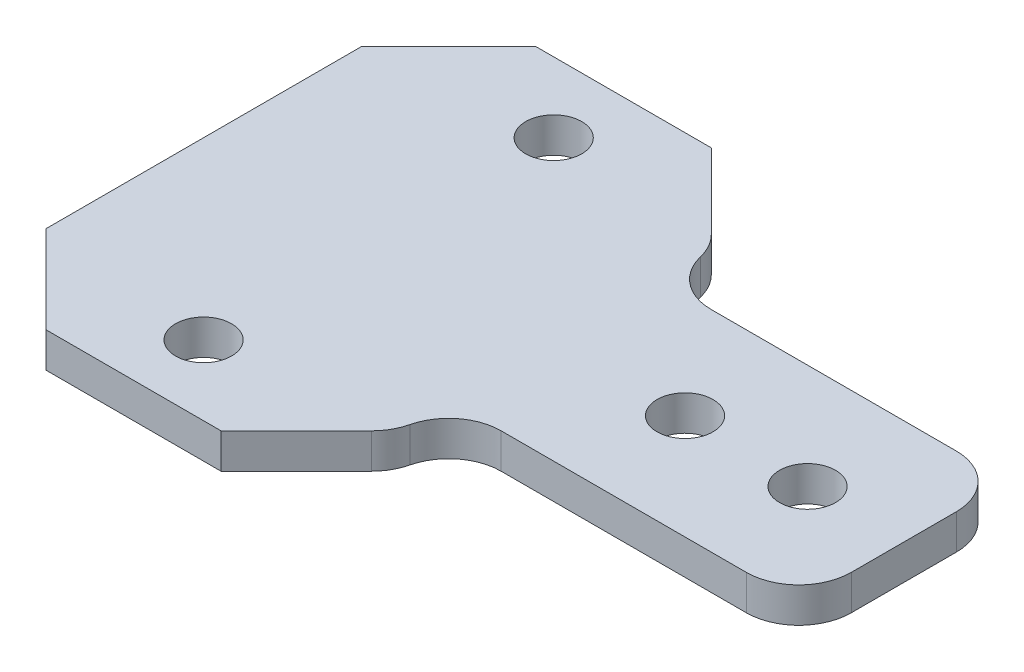
ISO-10303-21;
HEADER;
FILE_DESCRIPTION(('STEP AP214'),'2;1');
FILE_NAME('part.step','',(''),(''),'','','');
FILE_SCHEMA(('AUTOMOTIVE_DESIGN { 1 0 10303 214 1 1 1 1 }'));
ENDSEC;
DATA;
#1=APPLICATION_CONTEXT('core data for automotive mechanical design processes');
#2=APPLICATION_PROTOCOL_DEFINITION('international standard','automotive_design',2000,#1);
#3=PRODUCT_CONTEXT('',#1,'mechanical');
#4=PRODUCT('Part','Part','',(#3));
#5=PRODUCT_RELATED_PRODUCT_CATEGORY('part','',(#4));
#6=PRODUCT_DEFINITION_FORMATION('','',#4);
#7=PRODUCT_DEFINITION_CONTEXT('part definition',#1,'design');
#8=PRODUCT_DEFINITION('design','',#6,#7);
#9=PRODUCT_DEFINITION_SHAPE('','',#8);
#10=(LENGTH_UNIT() NAMED_UNIT(*) SI_UNIT(.MILLI.,.METRE.));
#11=(NAMED_UNIT(*) PLANE_ANGLE_UNIT() SI_UNIT($,.RADIAN.));
#12=(NAMED_UNIT(*) SI_UNIT($,.STERADIAN.) SOLID_ANGLE_UNIT());
#13=UNCERTAINTY_MEASURE_WITH_UNIT(LENGTH_MEASURE(1.E-05),#10,'distance_accuracy_value','');
#14=(GEOMETRIC_REPRESENTATION_CONTEXT(3) GLOBAL_UNCERTAINTY_ASSIGNED_CONTEXT((#13)) GLOBAL_UNIT_ASSIGNED_CONTEXT((#10,
#11,#12)) REPRESENTATION_CONTEXT('',''));
#15=CARTESIAN_POINT('',(0.,0.,0.));
#16=DIRECTION('',(0.,0.,1.));
#17=DIRECTION('',(1.,0.,0.));
#18=AXIS2_PLACEMENT_3D('',#15,#16,#17);
#19=CARTESIAN_POINT('',(0.,2.,0.));
#20=DIRECTION('',(0.,-1.,0.));
#21=DIRECTION('',(0.,0.,-1.));
#22=AXIS2_PLACEMENT_3D('',#19,#20,#21);
#23=PLANE('',#22);
#24=DIRECTION('',(-0.707106781186549,0.,0.707106781186547));
#25=VECTOR('',#24,1.);
#26=CARTESIAN_POINT('',(10.,2.,9.));
#27=LINE('',#26,#25);
#28=CARTESIAN_POINT('',(4.99999999999999,2.,14.));
#29=VERTEX_POINT('',#28);
#30=CARTESIAN_POINT('',(9.28956136268815,2.,9.71043863731185));
#31=VERTEX_POINT('',#30);
#32=EDGE_CURVE('E196',#29,#31,#27,.F.);
#33=ORIENTED_EDGE('',*,*,#32,.T.);
#34=CARTESIAN_POINT('',(7.16824101912851,2.,7.58911829375221));
#35=DIRECTION('',(0.,-1.,0.));
#36=DIRECTION('',(0.,0.,-1.));
#37=AXIS2_PLACEMENT_3D('',#34,#35,#36);
#38=CIRCLE('',#37,3.);
#39=CARTESIAN_POINT('',(10.0841205095643,2.,8.29455914687611));
#40=VERTEX_POINT('',#39);
#41=EDGE_CURVE('E249',#31,#40,#38,.F.);
#42=ORIENTED_EDGE('',*,*,#41,.T.);
#43=CARTESIAN_POINT('',(13.,2.,9.));
#44=DIRECTION('',(0.,-1.,0.));
#45=DIRECTION('',(0.,0.,-1.));
#46=AXIS2_PLACEMENT_3D('',#43,#44,#45);
#47=CIRCLE('',#46,3.);
#48=CARTESIAN_POINT('',(13.,2.,6.));
#49=VERTEX_POINT('',#48);
#50=EDGE_CURVE('E233',#40,#49,#47,.T.);
#51=ORIENTED_EDGE('',*,*,#50,.T.);
#52=DIRECTION('',(1.,0.,0.));
#53=VECTOR('',#52,1.);
#54=CARTESIAN_POINT('',(10.,2.,6.));
#55=LINE('',#54,#53);
#56=CARTESIAN_POINT('',(27.,2.,6.));
#57=VERTEX_POINT('',#56);
#58=EDGE_CURVE('E174',#49,#57,#55,.T.);
#59=ORIENTED_EDGE('',*,*,#58,.T.);
#60=CARTESIAN_POINT('',(27.,2.,3.));
#61=DIRECTION('',(0.,-1.,0.));
#62=DIRECTION('',(0.,0.,-1.));
#63=AXIS2_PLACEMENT_3D('',#60,#61,#62);
#64=CIRCLE('',#63,3.);
#65=CARTESIAN_POINT('',(30.,2.,3.));
#66=VERTEX_POINT('',#65);
#67=EDGE_CURVE('E227',#57,#66,#64,.F.);
#68=ORIENTED_EDGE('',*,*,#67,.T.);
#69=DIRECTION('',(0.,0.,-1.));
#70=VECTOR('',#69,1.);
#71=CARTESIAN_POINT('',(30.,2.,-6.));
#72=LINE('',#71,#70);
#73=CARTESIAN_POINT('',(30.,2.,-3.));
#74=VERTEX_POINT('',#73);
#75=EDGE_CURVE('E178',#66,#74,#72,.T.);
#76=ORIENTED_EDGE('',*,*,#75,.T.);
#77=CARTESIAN_POINT('',(27.,2.,-3.));
#78=DIRECTION('',(0.,-1.,0.));
#79=DIRECTION('',(0.,0.,-1.));
#80=AXIS2_PLACEMENT_3D('',#77,#78,#79);
#81=CIRCLE('',#80,3.);
#82=CARTESIAN_POINT('',(27.,2.,-6.));
#83=VERTEX_POINT('',#82);
#84=EDGE_CURVE('E229',#74,#83,#81,.F.);
#85=ORIENTED_EDGE('',*,*,#84,.T.);
#86=DIRECTION('',(-1.,0.,0.));
#87=VECTOR('',#86,1.);
#88=CARTESIAN_POINT('',(10.,2.,-6.));
#89=LINE('',#88,#87);
#90=CARTESIAN_POINT('',(13.,2.,-6.));
#91=VERTEX_POINT('',#90);
#92=EDGE_CURVE('E259',#83,#91,#89,.T.);
#93=ORIENTED_EDGE('',*,*,#92,.T.);
#94=CARTESIAN_POINT('',(13.,2.,-9.));
#95=DIRECTION('',(0.,-1.,0.));
#96=DIRECTION('',(0.,0.,-1.));
#97=AXIS2_PLACEMENT_3D('',#94,#95,#96);
#98=CIRCLE('',#97,3.);
#99=CARTESIAN_POINT('',(10.0841205095643,2.,-8.29455914687609));
#100=VERTEX_POINT('',#99);
#101=EDGE_CURVE('E237',#91,#100,#98,.T.);
#102=ORIENTED_EDGE('',*,*,#101,.T.);
#103=CARTESIAN_POINT('',(7.16824101912852,2.,-7.58911829375219));
#104=DIRECTION('',(0.,-1.,0.));
#105=DIRECTION('',(0.,0.,-1.));
#106=AXIS2_PLACEMENT_3D('',#103,#104,#105);
#107=CIRCLE('',#106,3.);
#108=CARTESIAN_POINT('',(9.28956136268816,2.,-9.71043863731183));
#109=VERTEX_POINT('',#108);
#110=EDGE_CURVE('E50',#100,#109,#107,.F.);
#111=ORIENTED_EDGE('',*,*,#110,.T.);
#112=DIRECTION('',(0.707106781186547,0.,0.707106781186548));
#113=VECTOR('',#112,1.);
#114=CARTESIAN_POINT('',(4.99999999999999,2.,-14.));
#115=LINE('',#114,#113);
#116=CARTESIAN_POINT('',(4.99999999999999,2.,-14.));
#117=VERTEX_POINT('',#116);
#118=EDGE_CURVE('E194',#109,#117,#115,.F.);
#119=ORIENTED_EDGE('',*,*,#118,.T.);
#120=DIRECTION('',(-1.,0.,0.));
#121=VECTOR('',#120,1.);
#122=CARTESIAN_POINT('',(-10.,2.,-14.));
#123=LINE('',#122,#121);
#124=CARTESIAN_POINT('',(-4.99999999999999,2.,-14.));
#125=VERTEX_POINT('',#124);
#126=EDGE_CURVE('E264',#117,#125,#123,.T.);
#127=ORIENTED_EDGE('',*,*,#126,.T.);
#128=DIRECTION('',(0.707106781186549,0.,-0.707106781186546));
#129=VECTOR('',#128,1.);
#130=CARTESIAN_POINT('',(-10.,2.,-9.00000000000001));
#131=LINE('',#130,#129);
#132=CARTESIAN_POINT('',(-10.,2.,-9.00000000000001));
#133=VERTEX_POINT('',#132);
#134=EDGE_CURVE('E192',#125,#133,#131,.F.);
#135=ORIENTED_EDGE('',*,*,#134,.T.);
#136=DIRECTION('',(0.,0.,1.));
#137=VECTOR('',#136,1.);
#138=CARTESIAN_POINT('',(-9.99999999999999,2.,14.));
#139=LINE('',#138,#137);
#140=CARTESIAN_POINT('',(-9.99999999999999,2.,9.));
#141=VERTEX_POINT('',#140);
#142=EDGE_CURVE('E267',#133,#141,#139,.T.);
#143=ORIENTED_EDGE('',*,*,#142,.T.);
#144=DIRECTION('',(-0.707106781186547,0.,-0.707106781186548));
#145=VECTOR('',#144,1.);
#146=CARTESIAN_POINT('',(-5.,2.,14.));
#147=LINE('',#146,#145);
#148=CARTESIAN_POINT('',(-5.,2.,14.));
#149=VERTEX_POINT('',#148);
#150=EDGE_CURVE('E190',#141,#149,#147,.F.);
#151=ORIENTED_EDGE('',*,*,#150,.T.);
#152=DIRECTION('',(1.,0.,0.));
#153=VECTOR('',#152,1.);
#154=CARTESIAN_POINT('',(-9.99999999999999,2.,14.));
#155=LINE('',#154,#153);
#156=EDGE_CURVE('E158',#149,#29,#155,.T.);
#157=ORIENTED_EDGE('',*,*,#156,.T.);
#158=EDGE_LOOP('',(#33,#42,#51,#59,#68,#76,#85,#93,#102,#111,#119,#127,#135,#143,#151,#157));
#159=FACE_BOUND('',#158,.T.);
#160=CARTESIAN_POINT('',(0.,2.,-10.));
#161=DIRECTION('',(0.,1.,0.));
#162=DIRECTION('',(0.,0.,1.));
#163=AXIS2_PLACEMENT_3D('',#160,#161,#162);
#164=CIRCLE('',#163,1.6);
#165=CARTESIAN_POINT('',(0.,2.,-8.4));
#166=VERTEX_POINT('',#165);
#167=EDGE_CURVE('E278',#166,#166,#164,.T.);
#168=ORIENTED_EDGE('',*,*,#167,.F.);
#169=EDGE_LOOP('',(#168));
#170=FACE_BOUND('',#169,.T.);
#171=CARTESIAN_POINT('',(17.5,2.,0.));
#172=DIRECTION('',(0.,1.,0.));
#173=DIRECTION('',(0.,0.,1.));
#174=AXIS2_PLACEMENT_3D('',#171,#172,#173);
#175=CIRCLE('',#174,1.6);
#176=CARTESIAN_POINT('',(17.5,2.,1.6));
#177=VERTEX_POINT('',#176);
#178=EDGE_CURVE('E355',#177,#177,#175,.T.);
#179=ORIENTED_EDGE('',*,*,#178,.F.);
#180=EDGE_LOOP('',(#179));
#181=FACE_BOUND('',#180,.T.);
#182=CARTESIAN_POINT('',(24.5,2.,0.));
#183=DIRECTION('',(0.,1.,0.));
#184=DIRECTION('',(0.,0.,1.));
#185=AXIS2_PLACEMENT_3D('',#182,#183,#184);
#186=CIRCLE('',#185,1.6);
#187=CARTESIAN_POINT('',(24.5,2.,1.6));
#188=VERTEX_POINT('',#187);
#189=EDGE_CURVE('E349',#188,#188,#186,.T.);
#190=ORIENTED_EDGE('',*,*,#189,.F.);
#191=EDGE_LOOP('',(#190));
#192=FACE_BOUND('',#191,.T.);
#193=CARTESIAN_POINT('',(0.,2.,10.));
#194=DIRECTION('',(0.,1.,0.));
#195=DIRECTION('',(0.,0.,-1.));
#196=AXIS2_PLACEMENT_3D('',#193,#194,#195);
#197=CIRCLE('',#196,1.6);
#198=CARTESIAN_POINT('',(0.,2.,8.4));
#199=VERTEX_POINT('',#198);
#200=EDGE_CURVE('E340',#199,#199,#197,.T.);
#201=ORIENTED_EDGE('',*,*,#200,.F.);
#202=EDGE_LOOP('',(#201));
#203=FACE_BOUND('',#202,.T.);
#204=ADVANCED_FACE('F35',(#159,#170,#181,#192,#203),#23,.F.);
#205=CARTESIAN_POINT('',(0.,0.,0.));
#206=DIRECTION('',(0.,-1.,0.));
#207=DIRECTION('',(0.,0.,-1.));
#208=AXIS2_PLACEMENT_3D('',#205,#206,#207);
#209=PLANE('',#208);
#210=CARTESIAN_POINT('',(24.5,0.,0.));
#211=DIRECTION('',(0.,1.,0.));
#212=DIRECTION('',(0.,0.,1.));
#213=AXIS2_PLACEMENT_3D('',#210,#211,#212);
#214=CIRCLE('',#213,1.6);
#215=CARTESIAN_POINT('',(24.5,0.,1.6));
#216=VERTEX_POINT('',#215);
#217=EDGE_CURVE('E346',#216,#216,#214,.T.);
#218=ORIENTED_EDGE('',*,*,#217,.T.);
#219=EDGE_LOOP('',(#218));
#220=FACE_BOUND('',#219,.T.);
#221=CARTESIAN_POINT('',(0.,0.,-10.));
#222=DIRECTION('',(0.,1.,0.));
#223=DIRECTION('',(0.,0.,1.));
#224=AXIS2_PLACEMENT_3D('',#221,#222,#223);
#225=CIRCLE('',#224,1.6);
#226=CARTESIAN_POINT('',(0.,0.,-8.4));
#227=VERTEX_POINT('',#226);
#228=EDGE_CURVE('E358',#227,#227,#225,.T.);
#229=ORIENTED_EDGE('',*,*,#228,.T.);
#230=EDGE_LOOP('',(#229));
#231=FACE_BOUND('',#230,.T.);
#232=CARTESIAN_POINT('',(13.,0.,9.));
#233=DIRECTION('',(0.,-1.,0.));
#234=DIRECTION('',(0.,0.,-1.));
#235=AXIS2_PLACEMENT_3D('',#232,#233,#234);
#236=CIRCLE('',#235,3.);
#237=CARTESIAN_POINT('',(13.,0.,6.));
#238=VERTEX_POINT('',#237);
#239=CARTESIAN_POINT('',(10.0841205095643,0.,8.29455914687611));
#240=VERTEX_POINT('',#239);
#241=EDGE_CURVE('E231',#238,#240,#236,.F.);
#242=ORIENTED_EDGE('',*,*,#241,.T.);
#243=CARTESIAN_POINT('',(7.16824101912851,0.,7.58911829375221));
#244=DIRECTION('',(0.,-1.,0.));
#245=DIRECTION('',(0.,0.,-1.));
#246=AXIS2_PLACEMENT_3D('',#243,#244,#245);
#247=CIRCLE('',#246,3.);
#248=CARTESIAN_POINT('',(9.28956136268815,0.,9.71043863731185));
#249=VERTEX_POINT('',#248);
#250=EDGE_CURVE('E244',#240,#249,#247,.T.);
#251=ORIENTED_EDGE('',*,*,#250,.T.);
#252=DIRECTION('',(0.707106781186549,0.,-0.707106781186547));
#253=VECTOR('',#252,1.);
#254=CARTESIAN_POINT('',(9.49999999999999,0.,9.50000000000002));
#255=LINE('',#254,#253);
#256=CARTESIAN_POINT('',(4.99999999999999,0.,14.));
#257=VERTEX_POINT('',#256);
#258=EDGE_CURVE('E168',#249,#257,#255,.F.);
#259=ORIENTED_EDGE('',*,*,#258,.T.);
#260=DIRECTION('',(1.,0.,0.));
#261=VECTOR('',#260,1.);
#262=CARTESIAN_POINT('',(-9.99999999999999,0.,14.));
#263=LINE('',#262,#261);
#264=CARTESIAN_POINT('',(-5.,0.,14.));
#265=VERTEX_POINT('',#264);
#266=EDGE_CURVE('E164',#265,#257,#263,.T.);
#267=ORIENTED_EDGE('',*,*,#266,.F.);
#268=DIRECTION('',(0.707106781186547,0.,0.707106781186548));
#269=VECTOR('',#268,1.);
#270=CARTESIAN_POINT('',(-9.50000000000001,0.,9.49999999999999));
#271=LINE('',#270,#269);
#272=CARTESIAN_POINT('',(-9.99999999999999,0.,9.));
#273=VERTEX_POINT('',#272);
#274=EDGE_CURVE('E147',#265,#273,#271,.F.);
#275=ORIENTED_EDGE('',*,*,#274,.T.);
#276=DIRECTION('',(0.,0.,1.));
#277=VECTOR('',#276,1.);
#278=CARTESIAN_POINT('',(-9.99999999999999,0.,14.));
#279=LINE('',#278,#277);
#280=CARTESIAN_POINT('',(-10.,0.,-9.00000000000001));
#281=VERTEX_POINT('',#280);
#282=EDGE_CURVE('E175',#281,#273,#279,.T.);
#283=ORIENTED_EDGE('',*,*,#282,.F.);
#284=DIRECTION('',(-0.707106781186549,0.,0.707106781186546));
#285=VECTOR('',#284,1.);
#286=CARTESIAN_POINT('',(-9.49999999999998,0.,-9.50000000000002));
#287=LINE('',#286,#285);
#288=CARTESIAN_POINT('',(-4.99999999999999,0.,-14.));
#289=VERTEX_POINT('',#288);
#290=EDGE_CURVE('E157',#281,#289,#287,.F.);
#291=ORIENTED_EDGE('',*,*,#290,.T.);
#292=DIRECTION('',(-1.,0.,0.));
#293=VECTOR('',#292,1.);
#294=CARTESIAN_POINT('',(-10.,0.,-14.));
#295=LINE('',#294,#293);
#296=CARTESIAN_POINT('',(4.99999999999999,0.,-14.));
#297=VERTEX_POINT('',#296);
#298=EDGE_CURVE('E180',#297,#289,#295,.T.);
#299=ORIENTED_EDGE('',*,*,#298,.F.);
#300=DIRECTION('',(-0.707106781186547,0.,-0.707106781186548));
#301=VECTOR('',#300,1.);
#302=CARTESIAN_POINT('',(9.5,0.,-9.49999999999999));
#303=LINE('',#302,#301);
#304=CARTESIAN_POINT('',(9.28956136268816,0.,-9.71043863731183));
#305=VERTEX_POINT('',#304);
#306=EDGE_CURVE('E185',#297,#305,#303,.F.);
#307=ORIENTED_EDGE('',*,*,#306,.T.);
#308=CARTESIAN_POINT('',(7.16824101912852,0.,-7.58911829375219));
#309=DIRECTION('',(0.,-1.,0.));
#310=DIRECTION('',(0.,0.,-1.));
#311=AXIS2_PLACEMENT_3D('',#308,#309,#310);
#312=CIRCLE('',#311,3.);
#313=CARTESIAN_POINT('',(10.0841205095643,0.,-8.29455914687609));
#314=VERTEX_POINT('',#313);
#315=EDGE_CURVE('E242',#305,#314,#312,.T.);
#316=ORIENTED_EDGE('',*,*,#315,.T.);
#317=CARTESIAN_POINT('',(13.,0.,-9.));
#318=DIRECTION('',(0.,-1.,0.));
#319=DIRECTION('',(0.,0.,-1.));
#320=AXIS2_PLACEMENT_3D('',#317,#318,#319);
#321=CIRCLE('',#320,3.);
#322=CARTESIAN_POINT('',(13.,0.,-6.));
#323=VERTEX_POINT('',#322);
#324=EDGE_CURVE('E235',#314,#323,#321,.F.);
#325=ORIENTED_EDGE('',*,*,#324,.T.);
#326=DIRECTION('',(-1.,0.,0.));
#327=VECTOR('',#326,1.);
#328=CARTESIAN_POINT('',(10.,0.,-6.));
#329=LINE('',#328,#327);
#330=CARTESIAN_POINT('',(27.,0.,-6.));
#331=VERTEX_POINT('',#330);
#332=EDGE_CURVE('E281',#331,#323,#329,.T.);
#333=ORIENTED_EDGE('',*,*,#332,.F.);
#334=CARTESIAN_POINT('',(27.,0.,-3.));
#335=DIRECTION('',(0.,-1.,0.));
#336=DIRECTION('',(0.,0.,-1.));
#337=AXIS2_PLACEMENT_3D('',#334,#335,#336);
#338=CIRCLE('',#337,3.);
#339=CARTESIAN_POINT('',(30.,0.,-3.));
#340=VERTEX_POINT('',#339);
#341=EDGE_CURVE('E220',#331,#340,#338,.T.);
#342=ORIENTED_EDGE('',*,*,#341,.T.);
#343=DIRECTION('',(0.,0.,-1.));
#344=VECTOR('',#343,1.);
#345=CARTESIAN_POINT('',(30.,0.,-6.));
#346=LINE('',#345,#344);
#347=CARTESIAN_POINT('',(30.,0.,3.));
#348=VERTEX_POINT('',#347);
#349=EDGE_CURVE('E277',#348,#340,#346,.T.);
#350=ORIENTED_EDGE('',*,*,#349,.F.);
#351=CARTESIAN_POINT('',(27.,0.,3.));
#352=DIRECTION('',(0.,-1.,0.));
#353=DIRECTION('',(0.,0.,-1.));
#354=AXIS2_PLACEMENT_3D('',#351,#352,#353);
#355=CIRCLE('',#354,3.);
#356=CARTESIAN_POINT('',(27.,0.,6.));
#357=VERTEX_POINT('',#356);
#358=EDGE_CURVE('E218',#348,#357,#355,.T.);
#359=ORIENTED_EDGE('',*,*,#358,.T.);
#360=DIRECTION('',(1.,0.,0.));
#361=VECTOR('',#360,1.);
#362=CARTESIAN_POINT('',(10.,0.,6.));
#363=LINE('',#362,#361);
#364=EDGE_CURVE('E274',#238,#357,#363,.T.);
#365=ORIENTED_EDGE('',*,*,#364,.F.);
#366=EDGE_LOOP('',(#242,#251,#259,#267,#275,#283,#291,#299,#307,#316,#325,#333,#342,#350,#359,#365));
#367=FACE_BOUND('',#366,.T.);
#368=CARTESIAN_POINT('',(17.5,0.,0.));
#369=DIRECTION('',(0.,1.,0.));
#370=DIRECTION('',(0.,0.,1.));
#371=AXIS2_PLACEMENT_3D('',#368,#369,#370);
#372=CIRCLE('',#371,1.6);
#373=CARTESIAN_POINT('',(17.5,0.,1.6));
#374=VERTEX_POINT('',#373);
#375=EDGE_CURVE('E352',#374,#374,#372,.T.);
#376=ORIENTED_EDGE('',*,*,#375,.T.);
#377=EDGE_LOOP('',(#376));
#378=FACE_BOUND('',#377,.T.);
#379=CARTESIAN_POINT('',(0.,0.,10.));
#380=DIRECTION('',(0.,1.,0.));
#381=DIRECTION('',(0.,0.,-1.));
#382=AXIS2_PLACEMENT_3D('',#379,#380,#381);
#383=CIRCLE('',#382,1.6);
#384=CARTESIAN_POINT('',(0.,0.,8.4));
#385=VERTEX_POINT('',#384);
#386=EDGE_CURVE('E343',#385,#385,#383,.T.);
#387=ORIENTED_EDGE('',*,*,#386,.T.);
#388=EDGE_LOOP('',(#387));
#389=FACE_BOUND('',#388,.T.);
#390=ADVANCED_FACE('F171',(#220,#231,#367,#378,#389),#209,.T.);
#391=CARTESIAN_POINT('',(10.,2.,6.));
#392=DIRECTION('',(0.,0.,-1.));
#393=DIRECTION('',(-1.,0.,0.));
#394=AXIS2_PLACEMENT_3D('',#391,#392,#393);
#395=PLANE('',#394);
#396=ORIENTED_EDGE('',*,*,#58,.F.);
#397=DIRECTION('',(0.,-1.,0.));
#398=VECTOR('',#397,1.);
#399=CARTESIAN_POINT('',(13.,0.,6.));
#400=LINE('',#399,#398);
#401=EDGE_CURVE('E210',#49,#238,#400,.T.);
#402=ORIENTED_EDGE('',*,*,#401,.T.);
#403=ORIENTED_EDGE('',*,*,#364,.T.);
#404=DIRECTION('',(0.,-1.,0.));
#405=VECTOR('',#404,1.);
#406=CARTESIAN_POINT('',(27.,2.,6.));
#407=LINE('',#406,#405);
#408=EDGE_CURVE('E208',#357,#57,#407,.F.);
#409=ORIENTED_EDGE('',*,*,#408,.T.);
#410=EDGE_LOOP('',(#396,#402,#403,#409));
#411=FACE_BOUND('',#410,.T.);
#412=ADVANCED_FACE('F312',(#411),#395,.F.);
#413=CARTESIAN_POINT('',(30.,2.,-6.));
#414=DIRECTION('',(-1.,0.,0.));
#415=DIRECTION('',(0.,0.,1.));
#416=AXIS2_PLACEMENT_3D('',#413,#414,#415);
#417=PLANE('',#416);
#418=ORIENTED_EDGE('',*,*,#349,.T.);
#419=DIRECTION('',(0.,-1.,0.));
#420=VECTOR('',#419,1.);
#421=CARTESIAN_POINT('',(30.,2.,-3.));
#422=LINE('',#421,#420);
#423=EDGE_CURVE('E225',#340,#74,#422,.F.);
#424=ORIENTED_EDGE('',*,*,#423,.T.);
#425=ORIENTED_EDGE('',*,*,#75,.F.);
#426=DIRECTION('',(0.,-1.,0.));
#427=VECTOR('',#426,1.);
#428=CARTESIAN_POINT('',(30.,2.,3.));
#429=LINE('',#428,#427);
#430=EDGE_CURVE('E222',#66,#348,#429,.T.);
#431=ORIENTED_EDGE('',*,*,#430,.T.);
#432=EDGE_LOOP('',(#418,#424,#425,#431));
#433=FACE_BOUND('',#432,.T.);
#434=ADVANCED_FACE('F423',(#433),#417,.F.);
#435=CARTESIAN_POINT('',(10.,2.,-6.));
#436=DIRECTION('',(0.,0.,1.));
#437=DIRECTION('',(1.,0.,0.));
#438=AXIS2_PLACEMENT_3D('',#435,#436,#437);
#439=PLANE('',#438);
#440=ORIENTED_EDGE('',*,*,#332,.T.);
#441=DIRECTION('',(0.,-1.,0.));
#442=VECTOR('',#441,1.);
#443=CARTESIAN_POINT('',(13.,2.,-6.));
#444=LINE('',#443,#442);
#445=EDGE_CURVE('E216',#323,#91,#444,.F.);
#446=ORIENTED_EDGE('',*,*,#445,.T.);
#447=ORIENTED_EDGE('',*,*,#92,.F.);
#448=DIRECTION('',(0.,-1.,0.));
#449=VECTOR('',#448,1.);
#450=CARTESIAN_POINT('',(27.,2.,-6.));
#451=LINE('',#450,#449);
#452=EDGE_CURVE('E213',#83,#331,#451,.T.);
#453=ORIENTED_EDGE('',*,*,#452,.T.);
#454=EDGE_LOOP('',(#440,#446,#447,#453));
#455=FACE_BOUND('',#454,.T.);
#456=ADVANCED_FACE('F305',(#455),#439,.F.);
#457=CARTESIAN_POINT('',(-10.,2.,-14.));
#458=DIRECTION('',(0.,0.,1.));
#459=DIRECTION('',(1.,0.,0.));
#460=AXIS2_PLACEMENT_3D('',#457,#458,#459);
#461=PLANE('',#460);
#462=ORIENTED_EDGE('',*,*,#126,.F.);
#463=DIRECTION('',(0.,-1.,0.));
#464=VECTOR('',#463,1.);
#465=CARTESIAN_POINT('',(4.99999999999999,2.,-14.));
#466=LINE('',#465,#464);
#467=EDGE_CURVE('E201',#117,#297,#466,.T.);
#468=ORIENTED_EDGE('',*,*,#467,.T.);
#469=ORIENTED_EDGE('',*,*,#298,.T.);
#470=DIRECTION('',(0.,1.,0.));
#471=VECTOR('',#470,1.);
#472=CARTESIAN_POINT('',(-4.99999999999999,2.,-14.));
#473=LINE('',#472,#471);
#474=EDGE_CURVE('E199',#289,#125,#473,.T.);
#475=ORIENTED_EDGE('',*,*,#474,.T.);
#476=EDGE_LOOP('',(#462,#468,#469,#475));
#477=FACE_BOUND('',#476,.T.);
#478=ADVANCED_FACE('F288',(#477),#461,.F.);
#479=CARTESIAN_POINT('',(-9.99999999999999,2.,14.));
#480=DIRECTION('',(1.,0.,0.));
#481=DIRECTION('',(0.,0.,-1.));
#482=AXIS2_PLACEMENT_3D('',#479,#480,#481);
#483=PLANE('',#482);
#484=ORIENTED_EDGE('',*,*,#142,.F.);
#485=DIRECTION('',(0.,-1.,0.));
#486=VECTOR('',#485,1.);
#487=CARTESIAN_POINT('',(-10.,2.,-9.00000000000001));
#488=LINE('',#487,#486);
#489=EDGE_CURVE('E205',#133,#281,#488,.T.);
#490=ORIENTED_EDGE('',*,*,#489,.T.);
#491=ORIENTED_EDGE('',*,*,#282,.T.);
#492=DIRECTION('',(0.,1.,0.));
#493=VECTOR('',#492,1.);
#494=CARTESIAN_POINT('',(-9.99999999999999,2.,9.));
#495=LINE('',#494,#493);
#496=EDGE_CURVE('E152',#273,#141,#495,.T.);
#497=ORIENTED_EDGE('',*,*,#496,.T.);
#498=EDGE_LOOP('',(#484,#490,#491,#497));
#499=FACE_BOUND('',#498,.T.);
#500=ADVANCED_FACE('F296',(#499),#483,.F.);
#501=CARTESIAN_POINT('',(-9.99999999999999,2.,14.));
#502=DIRECTION('',(0.,0.,-1.));
#503=DIRECTION('',(-1.,0.,0.));
#504=AXIS2_PLACEMENT_3D('',#501,#502,#503);
#505=PLANE('',#504);
#506=ORIENTED_EDGE('',*,*,#266,.T.);
#507=DIRECTION('',(0.,1.,0.));
#508=VECTOR('',#507,1.);
#509=CARTESIAN_POINT('',(4.99999999999999,2.,14.));
#510=LINE('',#509,#508);
#511=EDGE_CURVE('E167',#257,#29,#510,.T.);
#512=ORIENTED_EDGE('',*,*,#511,.T.);
#513=ORIENTED_EDGE('',*,*,#156,.F.);
#514=DIRECTION('',(0.,-1.,0.));
#515=VECTOR('',#514,1.);
#516=CARTESIAN_POINT('',(-5.,2.,14.));
#517=LINE('',#516,#515);
#518=EDGE_CURVE('E151',#149,#265,#517,.T.);
#519=ORIENTED_EDGE('',*,*,#518,.T.);
#520=EDGE_LOOP('',(#506,#512,#513,#519));
#521=FACE_BOUND('',#520,.T.);
#522=ADVANCED_FACE('F163',(#521),#505,.F.);
#523=CARTESIAN_POINT('',(0.,2.,-10.));
#524=DIRECTION('',(0.,-1.,0.));
#525=DIRECTION('',(0.,0.,-1.));
#526=AXIS2_PLACEMENT_3D('',#523,#524,#525);
#527=CYLINDRICAL_SURFACE('',#526,1.6);
#528=ORIENTED_EDGE('',*,*,#167,.T.);
#529=EDGE_LOOP('',(#528));
#530=FACE_BOUND('',#529,.T.);
#531=ORIENTED_EDGE('',*,*,#228,.F.);
#532=EDGE_LOOP('',(#531));
#533=FACE_BOUND('',#532,.T.);
#534=ADVANCED_FACE('F303',(#530,#533),#527,.F.);
#535=CARTESIAN_POINT('',(17.5,2.,0.));
#536=DIRECTION('',(0.,-1.,0.));
#537=DIRECTION('',(0.,0.,-1.));
#538=AXIS2_PLACEMENT_3D('',#535,#536,#537);
#539=CYLINDRICAL_SURFACE('',#538,1.6);
#540=ORIENTED_EDGE('',*,*,#178,.T.);
#541=EDGE_LOOP('',(#540));
#542=FACE_BOUND('',#541,.T.);
#543=ORIENTED_EDGE('',*,*,#375,.F.);
#544=EDGE_LOOP('',(#543));
#545=FACE_BOUND('',#544,.T.);
#546=ADVANCED_FACE('F318',(#542,#545),#539,.F.);
#547=CARTESIAN_POINT('',(24.5,2.,0.));
#548=DIRECTION('',(0.,-1.,0.));
#549=DIRECTION('',(0.,0.,-1.));
#550=AXIS2_PLACEMENT_3D('',#547,#548,#549);
#551=CYLINDRICAL_SURFACE('',#550,1.6);
#552=ORIENTED_EDGE('',*,*,#189,.T.);
#553=EDGE_LOOP('',(#552));
#554=FACE_BOUND('',#553,.T.);
#555=ORIENTED_EDGE('',*,*,#217,.F.);
#556=EDGE_LOOP('',(#555));
#557=FACE_BOUND('',#556,.T.);
#558=ADVANCED_FACE('F322',(#554,#557),#551,.F.);
#559=CARTESIAN_POINT('',(0.,2.,10.));
#560=DIRECTION('',(0.,-1.,0.));
#561=DIRECTION('',(0.,0.,-1.));
#562=AXIS2_PLACEMENT_3D('',#559,#560,#561);
#563=CYLINDRICAL_SURFACE('',#562,1.6);
#564=ORIENTED_EDGE('',*,*,#200,.T.);
#565=EDGE_LOOP('',(#564));
#566=FACE_BOUND('',#565,.T.);
#567=ORIENTED_EDGE('',*,*,#386,.F.);
#568=EDGE_LOOP('',(#567));
#569=FACE_BOUND('',#568,.T.);
#570=ADVANCED_FACE('F326',(#566,#569),#563,.F.);
#571=CARTESIAN_POINT('',(10.,2.,9.));
#572=DIRECTION('',(-0.707106781186546,0.,-0.707106781186548));
#573=DIRECTION('',(0.,-1.,0.));
#574=AXIS2_PLACEMENT_3D('',#571,#572,#573);
#575=PLANE('',#574);
#576=ORIENTED_EDGE('',*,*,#258,.F.);
#577=DIRECTION('',(0.,1.,0.));
#578=VECTOR('',#577,1.);
#579=CARTESIAN_POINT('',(9.28956136268815,2.,9.71043863731185));
#580=LINE('',#579,#578);
#581=EDGE_CURVE('E246',#249,#31,#580,.T.);
#582=ORIENTED_EDGE('',*,*,#581,.T.);
#583=ORIENTED_EDGE('',*,*,#32,.F.);
#584=ORIENTED_EDGE('',*,*,#511,.F.);
#585=EDGE_LOOP('',(#576,#582,#583,#584));
#586=FACE_BOUND('',#585,.T.);
#587=ADVANCED_FACE('F329',(#586),#575,.F.);
#588=CARTESIAN_POINT('',(4.99999999999999,2.,-14.));
#589=DIRECTION('',(-0.707106781186548,0.,0.707106781186547));
#590=DIRECTION('',(0.,-1.,0.));
#591=AXIS2_PLACEMENT_3D('',#588,#589,#590);
#592=PLANE('',#591);
#593=ORIENTED_EDGE('',*,*,#118,.F.);
#594=DIRECTION('',(0.,1.,0.));
#595=VECTOR('',#594,1.);
#596=CARTESIAN_POINT('',(9.28956136268816,0.,-9.71043863731183));
#597=LINE('',#596,#595);
#598=EDGE_CURVE('E11',#109,#305,#597,.F.);
#599=ORIENTED_EDGE('',*,*,#598,.T.);
#600=ORIENTED_EDGE('',*,*,#306,.F.);
#601=ORIENTED_EDGE('',*,*,#467,.F.);
#602=EDGE_LOOP('',(#593,#599,#600,#601));
#603=FACE_BOUND('',#602,.T.);
#604=ADVANCED_FACE('F334',(#603),#592,.F.);
#605=CARTESIAN_POINT('',(-10.,2.,-9.00000000000001));
#606=DIRECTION('',(0.707106781186546,0.,0.707106781186549));
#607=DIRECTION('',(0.,-1.,0.));
#608=AXIS2_PLACEMENT_3D('',#605,#606,#607);
#609=PLANE('',#608);
#610=ORIENTED_EDGE('',*,*,#134,.F.);
#611=ORIENTED_EDGE('',*,*,#474,.F.);
#612=ORIENTED_EDGE('',*,*,#290,.F.);
#613=ORIENTED_EDGE('',*,*,#489,.F.);
#614=EDGE_LOOP('',(#610,#611,#612,#613));
#615=FACE_BOUND('',#614,.T.);
#616=ADVANCED_FACE('F292',(#615),#609,.F.);
#617=CARTESIAN_POINT('',(-5.,2.,14.));
#618=DIRECTION('',(0.707106781186548,0.,-0.707106781186547));
#619=DIRECTION('',(0.,-1.,0.));
#620=AXIS2_PLACEMENT_3D('',#617,#618,#619);
#621=PLANE('',#620);
#622=ORIENTED_EDGE('',*,*,#150,.F.);
#623=ORIENTED_EDGE('',*,*,#496,.F.);
#624=ORIENTED_EDGE('',*,*,#274,.F.);
#625=ORIENTED_EDGE('',*,*,#518,.F.);
#626=EDGE_LOOP('',(#622,#623,#624,#625));
#627=FACE_BOUND('',#626,.T.);
#628=ADVANCED_FACE('F150',(#627),#621,.F.);
#629=CARTESIAN_POINT('',(13.,2.,9.));
#630=DIRECTION('',(0.,1.,0.));
#631=DIRECTION('',(0.,0.,1.));
#632=AXIS2_PLACEMENT_3D('',#629,#630,#631);
#633=CYLINDRICAL_SURFACE('',#632,3.);
#634=ORIENTED_EDGE('',*,*,#50,.F.);
#635=DIRECTION('',(0.,1.,0.));
#636=VECTOR('',#635,1.);
#637=CARTESIAN_POINT('',(10.0841205095643,2.,8.29455914687611));
#638=LINE('',#637,#636);
#639=EDGE_CURVE('E239',#40,#240,#638,.F.);
#640=ORIENTED_EDGE('',*,*,#639,.T.);
#641=ORIENTED_EDGE('',*,*,#241,.F.);
#642=ORIENTED_EDGE('',*,*,#401,.F.);
#643=EDGE_LOOP('',(#634,#640,#641,#642));
#644=FACE_BOUND('',#643,.T.);
#645=ADVANCED_FACE('F389',(#644),#633,.F.);
#646=CARTESIAN_POINT('',(13.,2.,-9.));
#647=DIRECTION('',(0.,1.,0.));
#648=DIRECTION('',(0.,0.,1.));
#649=AXIS2_PLACEMENT_3D('',#646,#647,#648);
#650=CYLINDRICAL_SURFACE('',#649,3.);
#651=ORIENTED_EDGE('',*,*,#324,.F.);
#652=DIRECTION('',(0.,1.,0.));
#653=VECTOR('',#652,1.);
#654=CARTESIAN_POINT('',(10.0841205095643,2.,-8.29455914687609));
#655=LINE('',#654,#653);
#656=EDGE_CURVE('E43',#314,#100,#655,.T.);
#657=ORIENTED_EDGE('',*,*,#656,.T.);
#658=ORIENTED_EDGE('',*,*,#101,.F.);
#659=ORIENTED_EDGE('',*,*,#445,.F.);
#660=EDGE_LOOP('',(#651,#657,#658,#659));
#661=FACE_BOUND('',#660,.T.);
#662=ADVANCED_FACE('F253',(#661),#650,.F.);
#663=CARTESIAN_POINT('',(27.,2.,-3.));
#664=DIRECTION('',(0.,-1.,0.));
#665=DIRECTION('',(0.,0.,-1.));
#666=AXIS2_PLACEMENT_3D('',#663,#664,#665);
#667=CYLINDRICAL_SURFACE('',#666,3.);
#668=ORIENTED_EDGE('',*,*,#84,.F.);
#669=ORIENTED_EDGE('',*,*,#423,.F.);
#670=ORIENTED_EDGE('',*,*,#341,.F.);
#671=ORIENTED_EDGE('',*,*,#452,.F.);
#672=EDGE_LOOP('',(#668,#669,#670,#671));
#673=FACE_BOUND('',#672,.T.);
#674=ADVANCED_FACE('F395',(#673),#667,.T.);
#675=CARTESIAN_POINT('',(27.,2.,3.));
#676=DIRECTION('',(0.,-1.,0.));
#677=DIRECTION('',(0.,0.,-1.));
#678=AXIS2_PLACEMENT_3D('',#675,#676,#677);
#679=CYLINDRICAL_SURFACE('',#678,3.);
#680=ORIENTED_EDGE('',*,*,#67,.F.);
#681=ORIENTED_EDGE('',*,*,#408,.F.);
#682=ORIENTED_EDGE('',*,*,#358,.F.);
#683=ORIENTED_EDGE('',*,*,#430,.F.);
#684=EDGE_LOOP('',(#680,#681,#682,#683));
#685=FACE_BOUND('',#684,.T.);
#686=ADVANCED_FACE('F398',(#685),#679,.T.);
#687=CARTESIAN_POINT('',(7.16824101912851,2.,7.58911829375221));
#688=DIRECTION('',(0.,1.,0.));
#689=DIRECTION('',(0.,0.,1.));
#690=AXIS2_PLACEMENT_3D('',#687,#688,#689);
#691=CYLINDRICAL_SURFACE('',#690,3.);
#692=ORIENTED_EDGE('',*,*,#41,.F.);
#693=ORIENTED_EDGE('',*,*,#581,.F.);
#694=ORIENTED_EDGE('',*,*,#250,.F.);
#695=ORIENTED_EDGE('',*,*,#639,.F.);
#696=EDGE_LOOP('',(#692,#693,#694,#695));
#697=FACE_BOUND('',#696,.T.);
#698=ADVANCED_FACE('F401',(#697),#691,.T.);
#699=CARTESIAN_POINT('',(7.16824101912852,2.,-7.58911829375219));
#700=DIRECTION('',(0.,1.,0.));
#701=DIRECTION('',(0.,0.,1.));
#702=AXIS2_PLACEMENT_3D('',#699,#700,#701);
#703=CYLINDRICAL_SURFACE('',#702,3.);
#704=ORIENTED_EDGE('',*,*,#315,.F.);
#705=ORIENTED_EDGE('',*,*,#598,.F.);
#706=ORIENTED_EDGE('',*,*,#110,.F.);
#707=ORIENTED_EDGE('',*,*,#656,.F.);
#708=EDGE_LOOP('',(#704,#705,#706,#707));
#709=FACE_BOUND('',#708,.T.);
#710=ADVANCED_FACE('F37',(#709),#703,.T.);
#711=CLOSED_SHELL('',(#204,#390,#412,#434,#456,#478,#500,#522,#534,#546,#558,#570,#587,#604,
#616,#628,#645,#662,#674,#686,#698,#710));
#712=MANIFOLD_SOLID_BREP('B2',#711);
#713=ADVANCED_BREP_SHAPE_REPRESENTATION('',(#18,#712),#14);
#714=SHAPE_DEFINITION_REPRESENTATION(#9,#713);
ENDSEC;
END-ISO-10303-21;
